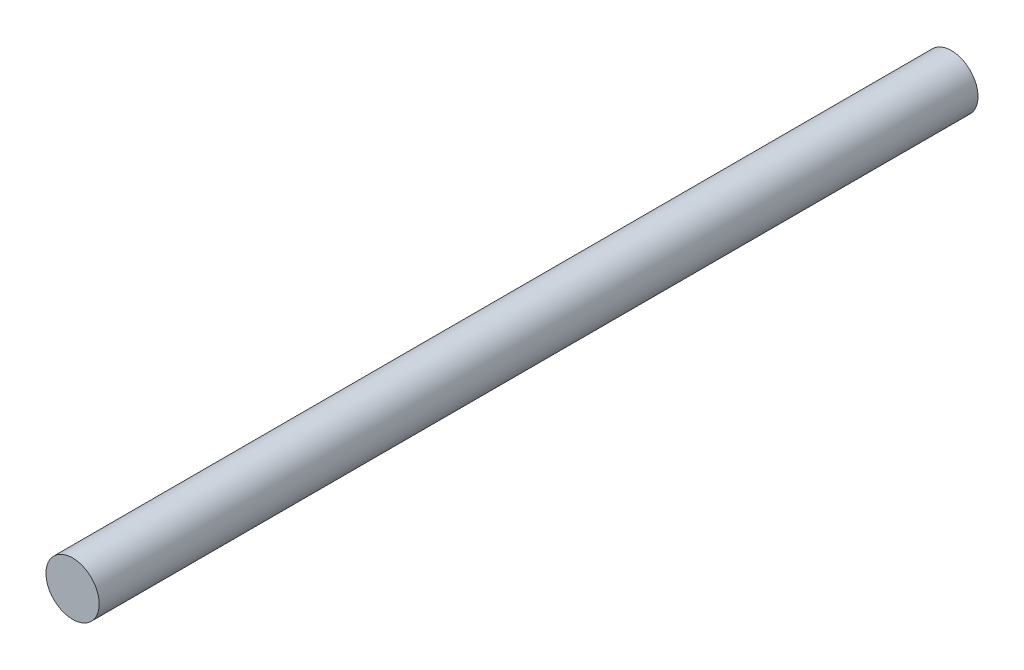
ISO-10303-21;
HEADER;
FILE_DESCRIPTION(('STEP AP214'),'2;1');
FILE_NAME('part.step','',(''),(''),'','','');
FILE_SCHEMA(('AUTOMOTIVE_DESIGN { 1 0 10303 214 1 1 1 1 }'));
ENDSEC;
DATA;
#1=APPLICATION_CONTEXT('core data for automotive mechanical design processes');
#2=APPLICATION_PROTOCOL_DEFINITION('international standard','automotive_design',2000,#1);
#3=PRODUCT_CONTEXT('',#1,'mechanical');
#4=PRODUCT('Part','Part','',(#3));
#5=PRODUCT_RELATED_PRODUCT_CATEGORY('part','',(#4));
#6=PRODUCT_DEFINITION_FORMATION('','',#4);
#7=PRODUCT_DEFINITION_CONTEXT('part definition',#1,'design');
#8=PRODUCT_DEFINITION('design','',#6,#7);
#9=PRODUCT_DEFINITION_SHAPE('','',#8);
#10=(LENGTH_UNIT() NAMED_UNIT(*) SI_UNIT(.MILLI.,.METRE.));
#11=(NAMED_UNIT(*) PLANE_ANGLE_UNIT() SI_UNIT($,.RADIAN.));
#12=(NAMED_UNIT(*) SI_UNIT($,.STERADIAN.) SOLID_ANGLE_UNIT());
#13=UNCERTAINTY_MEASURE_WITH_UNIT(LENGTH_MEASURE(1.E-05),#10,'distance_accuracy_value','');
#14=(GEOMETRIC_REPRESENTATION_CONTEXT(3) GLOBAL_UNCERTAINTY_ASSIGNED_CONTEXT((#13)) GLOBAL_UNIT_ASSIGNED_CONTEXT((#10,
#11,#12)) REPRESENTATION_CONTEXT('',''));
#15=CARTESIAN_POINT('',(0.,0.,0.));
#16=DIRECTION('',(0.,0.,1.));
#17=DIRECTION('',(1.,0.,0.));
#18=AXIS2_PLACEMENT_3D('',#15,#16,#17);
#19=CARTESIAN_POINT('',(0.,0.,330.));
#20=DIRECTION('',(0.,0.,-1.));
#21=DIRECTION('',(-1.,0.,0.));
#22=AXIS2_PLACEMENT_3D('',#19,#20,#21);
#23=CYLINDRICAL_SURFACE('',#22,10.);
#24=CARTESIAN_POINT('',(0.,0.,330.));
#25=DIRECTION('',(0.,0.,1.));
#26=DIRECTION('',(1.,0.,0.));
#27=AXIS2_PLACEMENT_3D('',#24,#25,#26);
#28=CIRCLE('',#27,10.);
#29=CARTESIAN_POINT('',(10.,0.,330.));
#30=VERTEX_POINT('',#29);
#31=EDGE_CURVE('E10',#30,#30,#28,.T.);
#32=ORIENTED_EDGE('',*,*,#31,.F.);
#33=EDGE_LOOP('',(#32));
#34=FACE_BOUND('',#33,.T.);
#35=CARTESIAN_POINT('',(0.,0.,0.));
#36=DIRECTION('',(0.,0.,1.));
#37=DIRECTION('',(1.,0.,0.));
#38=AXIS2_PLACEMENT_3D('',#35,#36,#37);
#39=CIRCLE('',#38,10.);
#40=CARTESIAN_POINT('',(10.,0.,0.));
#41=VERTEX_POINT('',#40);
#42=EDGE_CURVE('E46',#41,#41,#39,.T.);
#43=ORIENTED_EDGE('',*,*,#42,.T.);
#44=EDGE_LOOP('',(#43));
#45=FACE_BOUND('',#44,.T.);
#46=ADVANCED_FACE('F43',(#34,#45),#23,.T.);
#47=CARTESIAN_POINT('',(0.,0.,330.));
#48=DIRECTION('',(0.,0.,1.));
#49=DIRECTION('',(1.,0.,0.));
#50=AXIS2_PLACEMENT_3D('',#47,#48,#49);
#51=PLANE('',#50);
#52=ORIENTED_EDGE('',*,*,#31,.T.);
#53=EDGE_LOOP('',(#52));
#54=FACE_BOUND('',#53,.T.);
#55=ADVANCED_FACE('F60',(#54),#51,.T.);
#56=CARTESIAN_POINT('',(0.,0.,0.));
#57=DIRECTION('',(0.,0.,1.));
#58=DIRECTION('',(1.,0.,0.));
#59=AXIS2_PLACEMENT_3D('',#56,#57,#58);
#60=PLANE('',#59);
#61=ORIENTED_EDGE('',*,*,#42,.F.);
#62=EDGE_LOOP('',(#61));
#63=FACE_BOUND('',#62,.T.);
#64=ADVANCED_FACE('F58',(#63),#60,.F.);
#65=CLOSED_SHELL('',(#46,#55,#64));
#66=MANIFOLD_SOLID_BREP('B2',#65);
#67=ADVANCED_BREP_SHAPE_REPRESENTATION('',(#18,#66),#14);
#68=SHAPE_DEFINITION_REPRESENTATION(#9,#67);
ENDSEC;
END-ISO-10303-21;
